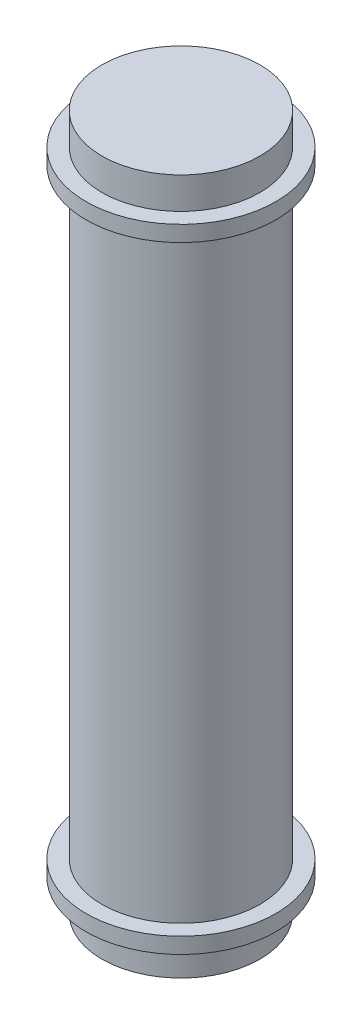
ISO-10303-21;
HEADER;
FILE_DESCRIPTION(('STEP AP214'),'2;1');
FILE_NAME('part.step','',(''),(''),'','','');
FILE_SCHEMA(('AUTOMOTIVE_DESIGN { 1 0 10303 214 1 1 1 1 }'));
ENDSEC;
DATA;
#1=APPLICATION_CONTEXT('core data for automotive mechanical design processes');
#2=APPLICATION_PROTOCOL_DEFINITION('international standard','automotive_design',2000,#1);
#3=PRODUCT_CONTEXT('',#1,'mechanical');
#4=PRODUCT('Part','Part','',(#3));
#5=PRODUCT_RELATED_PRODUCT_CATEGORY('part','',(#4));
#6=PRODUCT_DEFINITION_FORMATION('','',#4);
#7=PRODUCT_DEFINITION_CONTEXT('part definition',#1,'design');
#8=PRODUCT_DEFINITION('design','',#6,#7);
#9=PRODUCT_DEFINITION_SHAPE('','',#8);
#10=(LENGTH_UNIT() NAMED_UNIT(*) SI_UNIT(.MILLI.,.METRE.));
#11=(NAMED_UNIT(*) PLANE_ANGLE_UNIT() SI_UNIT($,.RADIAN.));
#12=(NAMED_UNIT(*) SI_UNIT($,.STERADIAN.) SOLID_ANGLE_UNIT());
#13=UNCERTAINTY_MEASURE_WITH_UNIT(LENGTH_MEASURE(1.E-05),#10,'distance_accuracy_value','');
#14=(GEOMETRIC_REPRESENTATION_CONTEXT(3) GLOBAL_UNCERTAINTY_ASSIGNED_CONTEXT((#13)) GLOBAL_UNIT_ASSIGNED_CONTEXT((#10,
#11,#12)) REPRESENTATION_CONTEXT('',''));
#15=CARTESIAN_POINT('',(0.,0.,0.));
#16=DIRECTION('',(0.,0.,1.));
#17=DIRECTION('',(1.,0.,0.));
#18=AXIS2_PLACEMENT_3D('',#15,#16,#17);
#19=CARTESIAN_POINT('',(0.,4.4,0.));
#20=DIRECTION('',(0.,-1.,0.));
#21=DIRECTION('',(0.,0.,-1.));
#22=AXIS2_PLACEMENT_3D('',#19,#20,#21);
#23=CYLINDRICAL_SURFACE('',#22,0.5);
#24=CARTESIAN_POINT('',(0.,0.3,0.));
#25=DIRECTION('',(0.,-1.,0.));
#26=DIRECTION('',(0.,0.,-1.));
#27=AXIS2_PLACEMENT_3D('',#24,#25,#26);
#28=CIRCLE('',#27,0.5);
#29=CARTESIAN_POINT('',(0.,0.3,-0.5));
#30=VERTEX_POINT('',#29);
#31=EDGE_CURVE('E40',#30,#30,#28,.T.);
#32=ORIENTED_EDGE('',*,*,#31,.F.);
#33=EDGE_LOOP('',(#32));
#34=FACE_BOUND('',#33,.T.);
#35=CARTESIAN_POINT('',(0.,4.1,0.));
#36=DIRECTION('',(0.,1.,0.));
#37=DIRECTION('',(0.,0.,1.));
#38=AXIS2_PLACEMENT_3D('',#35,#36,#37);
#39=CIRCLE('',#38,0.5);
#40=CARTESIAN_POINT('',(0.,4.1,0.5));
#41=VERTEX_POINT('',#40);
#42=EDGE_CURVE('E10',#41,#41,#39,.T.);
#43=ORIENTED_EDGE('',*,*,#42,.F.);
#44=EDGE_LOOP('',(#43));
#45=FACE_BOUND('',#44,.T.);
#46=ADVANCED_FACE('F33',(#34,#45),#23,.T.);
#47=CARTESIAN_POINT('',(0.,0.3,0.));
#48=DIRECTION('',(0.,-1.,0.));
#49=DIRECTION('',(0.,0.,-1.));
#50=AXIS2_PLACEMENT_3D('',#47,#48,#49);
#51=CYLINDRICAL_SURFACE('',#50,0.6);
#52=CARTESIAN_POINT('',(0.,0.3,0.));
#53=DIRECTION('',(0.,-1.,0.));
#54=DIRECTION('',(0.,0.,-1.));
#55=AXIS2_PLACEMENT_3D('',#52,#53,#54);
#56=CIRCLE('',#55,0.6);
#57=CARTESIAN_POINT('',(0.,0.3,-0.6));
#58=VERTEX_POINT('',#57);
#59=EDGE_CURVE('E61',#58,#58,#56,.T.);
#60=ORIENTED_EDGE('',*,*,#59,.T.);
#61=EDGE_LOOP('',(#60));
#62=FACE_BOUND('',#61,.T.);
#63=CARTESIAN_POINT('',(0.,0.2,0.));
#64=DIRECTION('',(0.,-1.,0.));
#65=DIRECTION('',(0.,0.,-1.));
#66=AXIS2_PLACEMENT_3D('',#63,#64,#65);
#67=CIRCLE('',#66,0.6);
#68=CARTESIAN_POINT('',(0.,0.2,-0.6));
#69=VERTEX_POINT('',#68);
#70=EDGE_CURVE('E56',#69,#69,#67,.T.);
#71=ORIENTED_EDGE('',*,*,#70,.F.);
#72=EDGE_LOOP('',(#71));
#73=FACE_BOUND('',#72,.T.);
#74=ADVANCED_FACE('F87',(#62,#73),#51,.T.);
#75=CARTESIAN_POINT('',(0.,0.3,0.));
#76=DIRECTION('',(0.,-1.,0.));
#77=DIRECTION('',(0.,0.,-1.));
#78=AXIS2_PLACEMENT_3D('',#75,#76,#77);
#79=PLANE('',#78);
#80=ORIENTED_EDGE('',*,*,#31,.T.);
#81=EDGE_LOOP('',(#80));
#82=FACE_BOUND('',#81,.T.);
#83=ORIENTED_EDGE('',*,*,#59,.F.);
#84=EDGE_LOOP('',(#83));
#85=FACE_BOUND('',#84,.T.);
#86=ADVANCED_FACE('F83',(#82,#85),#79,.F.);
#87=CARTESIAN_POINT('',(0.,0.2,0.));
#88=DIRECTION('',(0.,-1.,0.));
#89=DIRECTION('',(0.,0.,-1.));
#90=AXIS2_PLACEMENT_3D('',#87,#88,#89);
#91=PLANE('',#90);
#92=CARTESIAN_POINT('',(0.,0.2,0.));
#93=DIRECTION('',(0.,-1.,0.));
#94=DIRECTION('',(0.,0.,-1.));
#95=AXIS2_PLACEMENT_3D('',#92,#93,#94);
#96=CIRCLE('',#95,0.5);
#97=CARTESIAN_POINT('',(0.,0.2,-0.5));
#98=VERTEX_POINT('',#97);
#99=EDGE_CURVE('E52',#98,#98,#96,.T.);
#100=ORIENTED_EDGE('',*,*,#99,.F.);
#101=EDGE_LOOP('',(#100));
#102=FACE_BOUND('',#101,.T.);
#103=ORIENTED_EDGE('',*,*,#70,.T.);
#104=EDGE_LOOP('',(#103));
#105=FACE_BOUND('',#104,.T.);
#106=ADVANCED_FACE('F79',(#102,#105),#91,.T.);
#107=CARTESIAN_POINT('',(0.,0.,0.));
#108=DIRECTION('',(0.,1.,0.));
#109=DIRECTION('',(0.,0.,1.));
#110=AXIS2_PLACEMENT_3D('',#107,#108,#109);
#111=PLANE('',#110);
#112=CARTESIAN_POINT('',(0.,0.,0.));
#113=DIRECTION('',(0.,1.,0.));
#114=DIRECTION('',(0.,0.,1.));
#115=AXIS2_PLACEMENT_3D('',#112,#113,#114);
#116=CIRCLE('',#115,0.5);
#117=CARTESIAN_POINT('',(0.,0.,0.5));
#118=VERTEX_POINT('',#117);
#119=EDGE_CURVE('E49',#118,#118,#116,.T.);
#120=ORIENTED_EDGE('',*,*,#119,.F.);
#121=EDGE_LOOP('',(#120));
#122=FACE_BOUND('',#121,.T.);
#123=ADVANCED_FACE('F82',(#122),#111,.F.);
#124=ORIENTED_EDGE('',*,*,#99,.T.);
#125=EDGE_LOOP('',(#124));
#126=FACE_BOUND('',#125,.T.);
#127=ORIENTED_EDGE('',*,*,#119,.T.);
#128=EDGE_LOOP('',(#127));
#129=FACE_BOUND('',#128,.T.);
#130=ADVANCED_FACE('F35',(#126,#129),#23,.T.);
#131=CARTESIAN_POINT('',(0.,4.1,0.));
#132=DIRECTION('',(0.,1.,0.));
#133=DIRECTION('',(0.,0.,1.));
#134=AXIS2_PLACEMENT_3D('',#131,#132,#133);
#135=CYLINDRICAL_SURFACE('',#134,0.6);
#136=CARTESIAN_POINT('',(0.,4.1,0.));
#137=DIRECTION('',(0.,-1.,0.));
#138=DIRECTION('',(0.,0.,-1.));
#139=AXIS2_PLACEMENT_3D('',#136,#137,#138);
#140=CIRCLE('',#139,0.6);
#141=CARTESIAN_POINT('',(0.,4.1,-0.6));
#142=VERTEX_POINT('',#141);
#143=EDGE_CURVE('E57',#142,#142,#140,.T.);
#144=ORIENTED_EDGE('',*,*,#143,.F.);
#145=EDGE_LOOP('',(#144));
#146=FACE_BOUND('',#145,.T.);
#147=CARTESIAN_POINT('',(0.,4.2,0.));
#148=DIRECTION('',(0.,-1.,0.));
#149=DIRECTION('',(0.,0.,-1.));
#150=AXIS2_PLACEMENT_3D('',#147,#148,#149);
#151=CIRCLE('',#150,0.6);
#152=CARTESIAN_POINT('',(0.,4.2,-0.6));
#153=VERTEX_POINT('',#152);
#154=EDGE_CURVE('E64',#153,#153,#151,.T.);
#155=ORIENTED_EDGE('',*,*,#154,.T.);
#156=EDGE_LOOP('',(#155));
#157=FACE_BOUND('',#156,.T.);
#158=ADVANCED_FACE('F108',(#146,#157),#135,.T.);
#159=CARTESIAN_POINT('',(0.,4.1,0.));
#160=DIRECTION('',(0.,1.,0.));
#161=DIRECTION('',(0.,0.,-1.));
#162=AXIS2_PLACEMENT_3D('',#159,#160,#161);
#163=PLANE('',#162);
#164=ORIENTED_EDGE('',*,*,#42,.T.);
#165=EDGE_LOOP('',(#164));
#166=FACE_BOUND('',#165,.T.);
#167=ORIENTED_EDGE('',*,*,#143,.T.);
#168=EDGE_LOOP('',(#167));
#169=FACE_BOUND('',#168,.T.);
#170=ADVANCED_FACE('F112',(#166,#169),#163,.F.);
#171=CARTESIAN_POINT('',(0.,4.2,0.));
#172=DIRECTION('',(0.,1.,0.));
#173=DIRECTION('',(0.,0.,-1.));
#174=AXIS2_PLACEMENT_3D('',#171,#172,#173);
#175=PLANE('',#174);
#176=CARTESIAN_POINT('',(0.,4.2,0.));
#177=DIRECTION('',(0.,1.,0.));
#178=DIRECTION('',(0.,0.,1.));
#179=AXIS2_PLACEMENT_3D('',#176,#177,#178);
#180=CIRCLE('',#179,0.5);
#181=CARTESIAN_POINT('',(0.,4.2,0.5));
#182=VERTEX_POINT('',#181);
#183=EDGE_CURVE('E54',#182,#182,#180,.T.);
#184=ORIENTED_EDGE('',*,*,#183,.F.);
#185=EDGE_LOOP('',(#184));
#186=FACE_BOUND('',#185,.T.);
#187=ORIENTED_EDGE('',*,*,#154,.F.);
#188=EDGE_LOOP('',(#187));
#189=FACE_BOUND('',#188,.T.);
#190=ADVANCED_FACE('F101',(#186,#189),#175,.T.);
#191=CARTESIAN_POINT('',(0.,4.4,0.));
#192=DIRECTION('',(0.,1.,0.));
#193=DIRECTION('',(0.,0.,1.));
#194=AXIS2_PLACEMENT_3D('',#191,#192,#193);
#195=PLANE('',#194);
#196=CARTESIAN_POINT('',(0.,4.4,0.));
#197=DIRECTION('',(0.,1.,0.));
#198=DIRECTION('',(0.,0.,1.));
#199=AXIS2_PLACEMENT_3D('',#196,#197,#198);
#200=CIRCLE('',#199,0.5);
#201=CARTESIAN_POINT('',(0.,4.4,0.5));
#202=VERTEX_POINT('',#201);
#203=EDGE_CURVE('E44',#202,#202,#200,.T.);
#204=ORIENTED_EDGE('',*,*,#203,.T.);
#205=EDGE_LOOP('',(#204));
#206=FACE_BOUND('',#205,.T.);
#207=ADVANCED_FACE('F99',(#206),#195,.T.);
#208=ORIENTED_EDGE('',*,*,#183,.T.);
#209=EDGE_LOOP('',(#208));
#210=FACE_BOUND('',#209,.T.);
#211=ORIENTED_EDGE('',*,*,#203,.F.);
#212=EDGE_LOOP('',(#211));
#213=FACE_BOUND('',#212,.T.);
#214=ADVANCED_FACE('F97',(#210,#213),#23,.T.);
#215=CLOSED_SHELL('',(#46,#74,#86,#106,#123,#130,#158,#170,#190,#207,#214));
#216=MANIFOLD_SOLID_BREP('B2',#215);
#217=ADVANCED_BREP_SHAPE_REPRESENTATION('',(#18,#216),#14);
#218=SHAPE_DEFINITION_REPRESENTATION(#9,#217);
ENDSEC;
END-ISO-10303-21;
